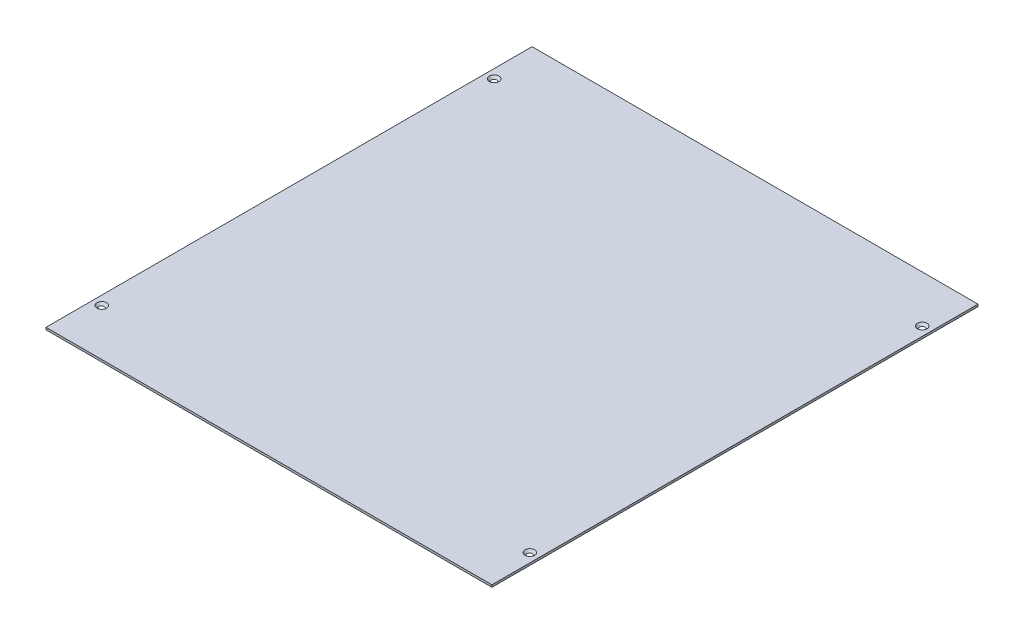
ISO-10303-21;
HEADER;
FILE_DESCRIPTION(('STEP AP214'),'2;1');
FILE_NAME('part.step','',(''),(''),'','','');
FILE_SCHEMA(('AUTOMOTIVE_DESIGN { 1 0 10303 214 1 1 1 1 }'));
ENDSEC;
DATA;
#1=APPLICATION_CONTEXT('core data for automotive mechanical design processes');
#2=APPLICATION_PROTOCOL_DEFINITION('international standard','automotive_design',2000,#1);
#3=PRODUCT_CONTEXT('',#1,'mechanical');
#4=PRODUCT('Part','Part','',(#3));
#5=PRODUCT_RELATED_PRODUCT_CATEGORY('part','',(#4));
#6=PRODUCT_DEFINITION_FORMATION('','',#4);
#7=PRODUCT_DEFINITION_CONTEXT('part definition',#1,'design');
#8=PRODUCT_DEFINITION('design','',#6,#7);
#9=PRODUCT_DEFINITION_SHAPE('','',#8);
#10=(LENGTH_UNIT() NAMED_UNIT(*) SI_UNIT(.MILLI.,.METRE.));
#11=(NAMED_UNIT(*) PLANE_ANGLE_UNIT() SI_UNIT($,.RADIAN.));
#12=(NAMED_UNIT(*) SI_UNIT($,.STERADIAN.) SOLID_ANGLE_UNIT());
#13=UNCERTAINTY_MEASURE_WITH_UNIT(LENGTH_MEASURE(1.E-05),#10,'distance_accuracy_value','');
#14=(GEOMETRIC_REPRESENTATION_CONTEXT(3) GLOBAL_UNCERTAINTY_ASSIGNED_CONTEXT((#13)) GLOBAL_UNIT_ASSIGNED_CONTEXT((#10,
#11,#12)) REPRESENTATION_CONTEXT('',''));
#15=CARTESIAN_POINT('',(0.,0.,0.));
#16=DIRECTION('',(0.,0.,1.));
#17=DIRECTION('',(1.,0.,0.));
#18=AXIS2_PLACEMENT_3D('',#15,#16,#17);
#19=CARTESIAN_POINT('',(0.,2.,0.));
#20=DIRECTION('',(0.,-1.,0.));
#21=DIRECTION('',(0.,0.,-1.));
#22=AXIS2_PLACEMENT_3D('',#19,#20,#21);
#23=PLANE('',#22);
#24=CARTESIAN_POINT('',(392.,2.,-394.));
#25=DIRECTION('',(0.,-1.,0.));
#26=DIRECTION('',(0.,0.,-1.));
#27=AXIS2_PLACEMENT_3D('',#24,#25,#26);
#28=CIRCLE('',#27,4.29999999999997);
#29=CARTESIAN_POINT('',(392.,2.,-398.3));
#30=VERTEX_POINT('',#29);
#31=EDGE_CURVE('E11',#30,#30,#28,.T.);
#32=ORIENTED_EDGE('',*,*,#31,.T.);
#33=EDGE_LOOP('',(#32));
#34=FACE_BOUND('',#33,.T.);
#35=CARTESIAN_POINT('',(392.000000000004,2.,-42.));
#36=DIRECTION('',(0.,-1.,0.));
#37=DIRECTION('',(0.,0.,-1.));
#38=AXIS2_PLACEMENT_3D('',#35,#36,#37);
#39=CIRCLE('',#38,4.29999999999997);
#40=CARTESIAN_POINT('',(392.000000000004,2.,-46.3));
#41=VERTEX_POINT('',#40);
#42=EDGE_CURVE('E42',#41,#41,#39,.T.);
#43=ORIENTED_EDGE('',*,*,#42,.T.);
#44=EDGE_LOOP('',(#43));
#45=FACE_BOUND('',#44,.T.);
#46=CARTESIAN_POINT('',(8.00000000000001,2.,-394.));
#47=DIRECTION('',(0.,-1.,0.));
#48=DIRECTION('',(0.,0.,-1.));
#49=AXIS2_PLACEMENT_3D('',#46,#47,#48);
#50=CIRCLE('',#49,4.30000000000003);
#51=CARTESIAN_POINT('',(8.00000000000001,2.,-398.3));
#52=VERTEX_POINT('',#51);
#53=EDGE_CURVE('E124',#52,#52,#50,.T.);
#54=ORIENTED_EDGE('',*,*,#53,.T.);
#55=EDGE_LOOP('',(#54));
#56=FACE_BOUND('',#55,.T.);
#57=CARTESIAN_POINT('',(8.00000000000369,2.,-42.));
#58=DIRECTION('',(0.,-1.,0.));
#59=DIRECTION('',(0.,0.,-1.));
#60=AXIS2_PLACEMENT_3D('',#57,#58,#59);
#61=CIRCLE('',#60,4.30000000000002);
#62=CARTESIAN_POINT('',(8.00000000000369,2.,-46.3));
#63=VERTEX_POINT('',#62);
#64=EDGE_CURVE('E121',#63,#63,#61,.T.);
#65=ORIENTED_EDGE('',*,*,#64,.T.);
#66=EDGE_LOOP('',(#65));
#67=FACE_BOUND('',#66,.T.);
#68=DIRECTION('',(0.,0.,1.));
#69=VECTOR('',#68,1.);
#70=CARTESIAN_POINT('',(0.,2.,0.));
#71=LINE('',#70,#69);
#72=CARTESIAN_POINT('',(0.,2.,-436.));
#73=VERTEX_POINT('',#72);
#74=CARTESIAN_POINT('',(0.,2.,0.));
#75=VERTEX_POINT('',#74);
#76=EDGE_CURVE('E85',#73,#75,#71,.T.);
#77=ORIENTED_EDGE('',*,*,#76,.T.);
#78=DIRECTION('',(1.,0.,0.));
#79=VECTOR('',#78,1.);
#80=CARTESIAN_POINT('',(0.,2.,0.));
#81=LINE('',#80,#79);
#82=CARTESIAN_POINT('',(400.,2.,0.));
#83=VERTEX_POINT('',#82);
#84=EDGE_CURVE('E81',#75,#83,#81,.T.);
#85=ORIENTED_EDGE('',*,*,#84,.T.);
#86=DIRECTION('',(0.,0.,-1.));
#87=VECTOR('',#86,1.);
#88=CARTESIAN_POINT('',(400.,2.,0.));
#89=LINE('',#88,#87);
#90=CARTESIAN_POINT('',(400.,2.,-436.));
#91=VERTEX_POINT('',#90);
#92=EDGE_CURVE('E83',#83,#91,#89,.T.);
#93=ORIENTED_EDGE('',*,*,#92,.T.);
#94=DIRECTION('',(-1.,0.,0.));
#95=VECTOR('',#94,1.);
#96=CARTESIAN_POINT('',(0.,2.,-436.));
#97=LINE('',#96,#95);
#98=EDGE_CURVE('E50',#91,#73,#97,.T.);
#99=ORIENTED_EDGE('',*,*,#98,.T.);
#100=EDGE_LOOP('',(#77,#85,#93,#99));
#101=FACE_BOUND('',#100,.T.);
#102=ADVANCED_FACE('F33',(#34,#45,#56,#67,#101),#23,.F.);
#103=CARTESIAN_POINT('',(0.,0.,0.));
#104=DIRECTION('',(0.,-1.,0.));
#105=DIRECTION('',(0.,0.,-1.));
#106=AXIS2_PLACEMENT_3D('',#103,#104,#105);
#107=PLANE('',#106);
#108=CARTESIAN_POINT('',(392.,0.,-394.));
#109=DIRECTION('',(0.,-1.,0.));
#110=DIRECTION('',(0.,0.,-1.));
#111=AXIS2_PLACEMENT_3D('',#108,#109,#110);
#112=CIRCLE('',#111,2.29999999999999);
#113=CARTESIAN_POINT('',(392.,0.,-396.3));
#114=VERTEX_POINT('',#113);
#115=EDGE_CURVE('E118',#114,#114,#112,.F.);
#116=ORIENTED_EDGE('',*,*,#115,.T.);
#117=EDGE_LOOP('',(#116));
#118=FACE_BOUND('',#117,.T.);
#119=CARTESIAN_POINT('',(392.000000000004,0.,-42.));
#120=DIRECTION('',(0.,-1.,0.));
#121=DIRECTION('',(0.,0.,-1.));
#122=AXIS2_PLACEMENT_3D('',#119,#120,#121);
#123=CIRCLE('',#122,2.29999999999999);
#124=CARTESIAN_POINT('',(392.000000000004,0.,-44.3));
#125=VERTEX_POINT('',#124);
#126=EDGE_CURVE('E115',#125,#125,#123,.F.);
#127=ORIENTED_EDGE('',*,*,#126,.T.);
#128=EDGE_LOOP('',(#127));
#129=FACE_BOUND('',#128,.T.);
#130=CARTESIAN_POINT('',(8.00000000000001,0.,-394.));
#131=DIRECTION('',(0.,-1.,0.));
#132=DIRECTION('',(0.,0.,-1.));
#133=AXIS2_PLACEMENT_3D('',#130,#131,#132);
#134=CIRCLE('',#133,2.30000000000004);
#135=CARTESIAN_POINT('',(8.00000000000001,0.,-396.3));
#136=VERTEX_POINT('',#135);
#137=EDGE_CURVE('E112',#136,#136,#134,.F.);
#138=ORIENTED_EDGE('',*,*,#137,.T.);
#139=EDGE_LOOP('',(#138));
#140=FACE_BOUND('',#139,.T.);
#141=CARTESIAN_POINT('',(8.00000000000369,0.,-42.));
#142=DIRECTION('',(0.,-1.,0.));
#143=DIRECTION('',(0.,0.,-1.));
#144=AXIS2_PLACEMENT_3D('',#141,#142,#143);
#145=CIRCLE('',#144,2.30000000000004);
#146=CARTESIAN_POINT('',(8.00000000000369,0.,-44.3));
#147=VERTEX_POINT('',#146);
#148=EDGE_CURVE('E109',#147,#147,#145,.F.);
#149=ORIENTED_EDGE('',*,*,#148,.T.);
#150=EDGE_LOOP('',(#149));
#151=FACE_BOUND('',#150,.T.);
#152=DIRECTION('',(0.,0.,1.));
#153=VECTOR('',#152,1.);
#154=CARTESIAN_POINT('',(0.,0.,0.));
#155=LINE('',#154,#153);
#156=CARTESIAN_POINT('',(0.,0.,-436.));
#157=VERTEX_POINT('',#156);
#158=CARTESIAN_POINT('',(0.,0.,0.));
#159=VERTEX_POINT('',#158);
#160=EDGE_CURVE('E100',#157,#159,#155,.T.);
#161=ORIENTED_EDGE('',*,*,#160,.F.);
#162=DIRECTION('',(-1.,0.,0.));
#163=VECTOR('',#162,1.);
#164=CARTESIAN_POINT('',(0.,0.,-436.));
#165=LINE('',#164,#163);
#166=CARTESIAN_POINT('',(400.,0.,-436.));
#167=VERTEX_POINT('',#166);
#168=EDGE_CURVE('E73',#167,#157,#165,.T.);
#169=ORIENTED_EDGE('',*,*,#168,.F.);
#170=DIRECTION('',(0.,0.,-1.));
#171=VECTOR('',#170,1.);
#172=CARTESIAN_POINT('',(400.,0.,0.));
#173=LINE('',#172,#171);
#174=CARTESIAN_POINT('',(400.,0.,0.));
#175=VERTEX_POINT('',#174);
#176=EDGE_CURVE('E67',#175,#167,#173,.T.);
#177=ORIENTED_EDGE('',*,*,#176,.F.);
#178=DIRECTION('',(1.,0.,0.));
#179=VECTOR('',#178,1.);
#180=CARTESIAN_POINT('',(0.,0.,0.));
#181=LINE('',#180,#179);
#182=EDGE_CURVE('E90',#159,#175,#181,.T.);
#183=ORIENTED_EDGE('',*,*,#182,.F.);
#184=EDGE_LOOP('',(#161,#169,#177,#183));
#185=FACE_BOUND('',#184,.T.);
#186=ADVANCED_FACE('F139',(#118,#129,#140,#151,#185),#107,.T.);
#187=CARTESIAN_POINT('',(0.,2.,0.));
#188=DIRECTION('',(1.,0.,0.));
#189=DIRECTION('',(0.,0.,-1.));
#190=AXIS2_PLACEMENT_3D('',#187,#188,#189);
#191=PLANE('',#190);
#192=ORIENTED_EDGE('',*,*,#160,.T.);
#193=DIRECTION('',(0.,-1.,0.));
#194=VECTOR('',#193,1.);
#195=CARTESIAN_POINT('',(0.,2.,0.));
#196=LINE('',#195,#194);
#197=EDGE_CURVE('E91',#75,#159,#196,.T.);
#198=ORIENTED_EDGE('',*,*,#197,.F.);
#199=ORIENTED_EDGE('',*,*,#76,.F.);
#200=DIRECTION('',(0.,-1.,0.));
#201=VECTOR('',#200,1.);
#202=CARTESIAN_POINT('',(0.,2.,-436.));
#203=LINE('',#202,#201);
#204=EDGE_CURVE('E96',#73,#157,#203,.T.);
#205=ORIENTED_EDGE('',*,*,#204,.T.);
#206=EDGE_LOOP('',(#192,#198,#199,#205));
#207=FACE_BOUND('',#206,.T.);
#208=ADVANCED_FACE('F142',(#207),#191,.F.);
#209=CARTESIAN_POINT('',(0.,2.,0.));
#210=DIRECTION('',(0.,0.,-1.));
#211=DIRECTION('',(-1.,0.,0.));
#212=AXIS2_PLACEMENT_3D('',#209,#210,#211);
#213=PLANE('',#212);
#214=ORIENTED_EDGE('',*,*,#182,.T.);
#215=DIRECTION('',(0.,-1.,0.));
#216=VECTOR('',#215,1.);
#217=CARTESIAN_POINT('',(400.,2.,0.));
#218=LINE('',#217,#216);
#219=EDGE_CURVE('E88',#83,#175,#218,.T.);
#220=ORIENTED_EDGE('',*,*,#219,.F.);
#221=ORIENTED_EDGE('',*,*,#84,.F.);
#222=ORIENTED_EDGE('',*,*,#197,.T.);
#223=EDGE_LOOP('',(#214,#220,#221,#222));
#224=FACE_BOUND('',#223,.T.);
#225=ADVANCED_FACE('F89',(#224),#213,.F.);
#226=CARTESIAN_POINT('',(400.,2.,0.));
#227=DIRECTION('',(-1.,0.,0.));
#228=DIRECTION('',(0.,0.,1.));
#229=AXIS2_PLACEMENT_3D('',#226,#227,#228);
#230=PLANE('',#229);
#231=ORIENTED_EDGE('',*,*,#176,.T.);
#232=DIRECTION('',(0.,-1.,0.));
#233=VECTOR('',#232,1.);
#234=CARTESIAN_POINT('',(400.,2.,-436.));
#235=LINE('',#234,#233);
#236=EDGE_CURVE('E92',#91,#167,#235,.T.);
#237=ORIENTED_EDGE('',*,*,#236,.F.);
#238=ORIENTED_EDGE('',*,*,#92,.F.);
#239=ORIENTED_EDGE('',*,*,#219,.T.);
#240=EDGE_LOOP('',(#231,#237,#238,#239));
#241=FACE_BOUND('',#240,.T.);
#242=ADVANCED_FACE('F94',(#241),#230,.F.);
#243=CARTESIAN_POINT('',(0.,2.,-436.));
#244=DIRECTION('',(0.,0.,1.));
#245=DIRECTION('',(1.,0.,0.));
#246=AXIS2_PLACEMENT_3D('',#243,#244,#245);
#247=PLANE('',#246);
#248=ORIENTED_EDGE('',*,*,#168,.T.);
#249=ORIENTED_EDGE('',*,*,#204,.F.);
#250=ORIENTED_EDGE('',*,*,#98,.F.);
#251=ORIENTED_EDGE('',*,*,#236,.T.);
#252=EDGE_LOOP('',(#248,#249,#250,#251));
#253=FACE_BOUND('',#252,.T.);
#254=ADVANCED_FACE('F151',(#253),#247,.F.);
#255=CARTESIAN_POINT('',(392.,-0.0500000000000357,-394.));
#256=DIRECTION('',(0.,1.,0.));
#257=DIRECTION('',(0.,0.,1.));
#258=AXIS2_PLACEMENT_3D('',#255,#256,#257);
#259=CONICAL_SURFACE('',#258,2.24999999999996,0.785398163397443);
#260=ORIENTED_EDGE('',*,*,#31,.F.);
#261=EDGE_LOOP('',(#260));
#262=FACE_BOUND('',#261,.T.);
#263=ORIENTED_EDGE('',*,*,#115,.F.);
#264=EDGE_LOOP('',(#263));
#265=FACE_BOUND('',#264,.T.);
#266=ADVANCED_FACE('F135',(#262,#265),#259,.F.);
#267=CARTESIAN_POINT('',(392.000000000004,-0.0500000000000357,-42.));
#268=DIRECTION('',(0.,1.,0.));
#269=DIRECTION('',(0.,0.,1.));
#270=AXIS2_PLACEMENT_3D('',#267,#268,#269);
#271=CONICAL_SURFACE('',#270,2.24999999999995,0.785398163397444);
#272=ORIENTED_EDGE('',*,*,#42,.F.);
#273=EDGE_LOOP('',(#272));
#274=FACE_BOUND('',#273,.T.);
#275=ORIENTED_EDGE('',*,*,#126,.F.);
#276=EDGE_LOOP('',(#275));
#277=FACE_BOUND('',#276,.T.);
#278=ADVANCED_FACE('F131',(#274,#277),#271,.F.);
#279=CARTESIAN_POINT('',(8.00000000000001,-0.0500000000000357,-394.));
#280=DIRECTION('',(0.,1.,0.));
#281=DIRECTION('',(0.,0.,1.));
#282=AXIS2_PLACEMENT_3D('',#279,#280,#281);
#283=CONICAL_SURFACE('',#282,2.25,0.785398163397445);
#284=ORIENTED_EDGE('',*,*,#53,.F.);
#285=EDGE_LOOP('',(#284));
#286=FACE_BOUND('',#285,.T.);
#287=ORIENTED_EDGE('',*,*,#137,.F.);
#288=EDGE_LOOP('',(#287));
#289=FACE_BOUND('',#288,.T.);
#290=ADVANCED_FACE('F134',(#286,#289),#283,.F.);
#291=CARTESIAN_POINT('',(8.00000000000369,-0.0500000000000357,-42.));
#292=DIRECTION('',(0.,1.,0.));
#293=DIRECTION('',(0.,0.,1.));
#294=AXIS2_PLACEMENT_3D('',#291,#292,#293);
#295=CONICAL_SURFACE('',#294,2.25,0.785398163397443);
#296=ORIENTED_EDGE('',*,*,#64,.F.);
#297=EDGE_LOOP('',(#296));
#298=FACE_BOUND('',#297,.T.);
#299=ORIENTED_EDGE('',*,*,#148,.F.);
#300=EDGE_LOOP('',(#299));
#301=FACE_BOUND('',#300,.T.);
#302=ADVANCED_FACE('F35',(#298,#301),#295,.F.);
#303=CLOSED_SHELL('',(#102,#186,#208,#225,#242,#254,#266,#278,#290,#302));
#304=MANIFOLD_SOLID_BREP('B2',#303);
#305=ADVANCED_BREP_SHAPE_REPRESENTATION('',(#18,#304),#14);
#306=SHAPE_DEFINITION_REPRESENTATION(#9,#305);
ENDSEC;
END-ISO-10303-21;
